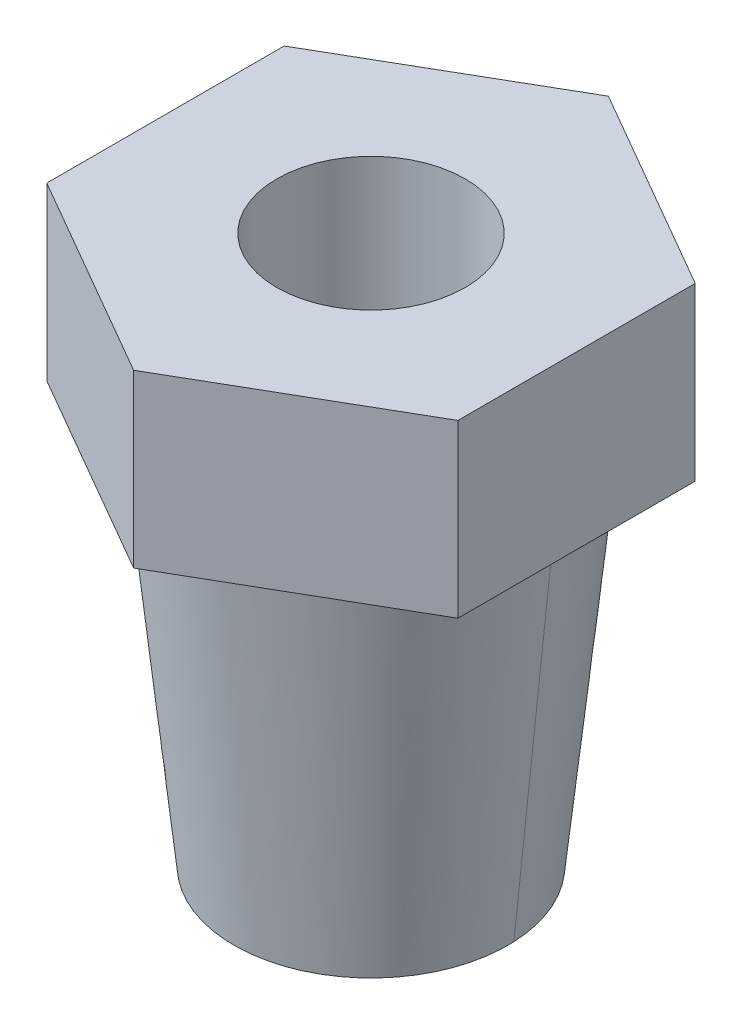
ISO-10303-21;
HEADER;
FILE_DESCRIPTION(('STEP AP214'),'2;1');
FILE_NAME('part.step','',(''),(''),'','','');
FILE_SCHEMA(('AUTOMOTIVE_DESIGN { 1 0 10303 214 1 1 1 1 }'));
ENDSEC;
DATA;
#1=APPLICATION_CONTEXT('core data for automotive mechanical design processes');
#2=APPLICATION_PROTOCOL_DEFINITION('international standard','automotive_design',2000,#1);
#3=PRODUCT_CONTEXT('',#1,'mechanical');
#4=PRODUCT('Part','Part','',(#3));
#5=PRODUCT_RELATED_PRODUCT_CATEGORY('part','',(#4));
#6=PRODUCT_DEFINITION_FORMATION('','',#4);
#7=PRODUCT_DEFINITION_CONTEXT('part definition',#1,'design');
#8=PRODUCT_DEFINITION('design','',#6,#7);
#9=PRODUCT_DEFINITION_SHAPE('','',#8);
#10=(LENGTH_UNIT() NAMED_UNIT(*) SI_UNIT(.MILLI.,.METRE.));
#11=(NAMED_UNIT(*) PLANE_ANGLE_UNIT() SI_UNIT($,.RADIAN.));
#12=(NAMED_UNIT(*) SI_UNIT($,.STERADIAN.) SOLID_ANGLE_UNIT());
#13=UNCERTAINTY_MEASURE_WITH_UNIT(LENGTH_MEASURE(1.E-05),#10,'distance_accuracy_value','');
#14=(GEOMETRIC_REPRESENTATION_CONTEXT(3) GLOBAL_UNCERTAINTY_ASSIGNED_CONTEXT((#13)) GLOBAL_UNIT_ASSIGNED_CONTEXT((#10,
#11,#12)) REPRESENTATION_CONTEXT('',''));
#15=CARTESIAN_POINT('',(0.,0.,0.));
#16=DIRECTION('',(0.,0.,1.));
#17=DIRECTION('',(1.,0.,0.));
#18=AXIS2_PLACEMENT_3D('',#15,#16,#17);
#19=CARTESIAN_POINT('',(0.,-5.,0.));
#20=DIRECTION('',(0.,1.,0.));
#21=DIRECTION('',(0.,0.,1.));
#22=AXIS2_PLACEMENT_3D('',#19,#20,#21);
#23=PLANE('',#22);
#24=DIRECTION('',(0.866025403784442,0.,0.499999999999995));
#25=VECTOR('',#24,1.);
#26=CARTESIAN_POINT('',(-5.99999999999996,-5.,3.46410161513783));
#27=LINE('',#26,#25);
#28=CARTESIAN_POINT('',(-5.99999999999996,-5.,3.46410161513783));
#29=VERTEX_POINT('',#28);
#30=CARTESIAN_POINT('',(0.,-5.,6.92820323027551));
#31=VERTEX_POINT('',#30);
#32=EDGE_CURVE('E147',#29,#31,#27,.T.);
#33=ORIENTED_EDGE('',*,*,#32,.F.);
#34=DIRECTION('',(0.,0.,1.));
#35=VECTOR('',#34,1.);
#36=CARTESIAN_POINT('',(-6.00000000000004,-5.,-3.4641016151377));
#37=LINE('',#36,#35);
#38=CARTESIAN_POINT('',(-6.00000000000004,-5.,-3.4641016151377));
#39=VERTEX_POINT('',#38);
#40=EDGE_CURVE('E123',#39,#29,#37,.T.);
#41=ORIENTED_EDGE('',*,*,#40,.F.);
#42=DIRECTION('',(-0.866025403784435,0.,0.500000000000007));
#43=VECTOR('',#42,1.);
#44=CARTESIAN_POINT('',(0.,-5.,-6.92820323027551));
#45=LINE('',#44,#43);
#46=CARTESIAN_POINT('',(0.,-5.,-6.92820323027551));
#47=VERTEX_POINT('',#46);
#48=EDGE_CURVE('E107',#47,#39,#45,.T.);
#49=ORIENTED_EDGE('',*,*,#48,.F.);
#50=DIRECTION('',(-0.866025403784442,0.,-0.499999999999995));
#51=VECTOR('',#50,1.);
#52=CARTESIAN_POINT('',(5.99999999999999,-5.,-3.46410161513778));
#53=LINE('',#52,#51);
#54=CARTESIAN_POINT('',(5.99999999999999,-5.,-3.46410161513778));
#55=VERTEX_POINT('',#54);
#56=EDGE_CURVE('E121',#55,#47,#53,.T.);
#57=ORIENTED_EDGE('',*,*,#56,.F.);
#58=DIRECTION('',(0.,0.,-1.));
#59=VECTOR('',#58,1.);
#60=CARTESIAN_POINT('',(6.00000000000001,-5.,3.46410161513774));
#61=LINE('',#60,#59);
#62=CARTESIAN_POINT('',(6.00000000000001,-5.,3.46410161513774));
#63=VERTEX_POINT('',#62);
#64=EDGE_CURVE('E126',#63,#55,#61,.T.);
#65=ORIENTED_EDGE('',*,*,#64,.F.);
#66=DIRECTION('',(0.866025403784438,0.,-0.500000000000001));
#67=VECTOR('',#66,1.);
#68=CARTESIAN_POINT('',(0.,-5.,6.92820323027551));
#69=LINE('',#68,#67);
#70=EDGE_CURVE('E128',#31,#63,#69,.T.);
#71=ORIENTED_EDGE('',*,*,#70,.F.);
#72=EDGE_LOOP('',(#33,#41,#49,#57,#65,#71));
#73=FACE_BOUND('',#72,.T.);
#74=CARTESIAN_POINT('',(0.,-5.,0.));
#75=DIRECTION('',(0.,1.,0.));
#76=DIRECTION('',(0.999204613771125,0.,-0.0398765572548238));
#77=AXIS2_PLACEMENT_3D('',#74,#75,#76);
#78=CIRCLE('',#77,5.1423305605899);
#79=CARTESIAN_POINT('',(5.13824042167769,-5.,-0.205058439022594));
#80=VERTEX_POINT('',#79);
#81=CARTESIAN_POINT('',(0.019253151585716,-5.,-5.14229451806593));
#82=VERTEX_POINT('',#81);
#83=EDGE_CURVE('E192',#80,#82,#78,.T.);
#84=ORIENTED_EDGE('',*,*,#83,.T.);
#85=CARTESIAN_POINT('',(0.,-5.,0.));
#86=DIRECTION('',(0.,1.,0.));
#87=DIRECTION('',(0.00374405172107575,0.,-0.999992991013792));
#88=AXIS2_PLACEMENT_3D('',#85,#86,#87);
#89=CIRCLE('',#88,5.1423305605899);
#90=EDGE_CURVE('E183',#82,#80,#89,.T.);
#91=ORIENTED_EDGE('',*,*,#90,.T.);
#92=EDGE_LOOP('',(#84,#91));
#93=FACE_BOUND('',#92,.T.);
#94=ADVANCED_FACE('F34',(#73,#93),#23,.F.);
#95=CARTESIAN_POINT('',(-5.99999999999996,-5.,3.46410161513783));
#96=DIRECTION('',(-0.499999999999995,0.,0.866025403784442));
#97=DIRECTION('',(0.866025403784442,0.,0.499999999999995));
#98=AXIS2_PLACEMENT_3D('',#95,#96,#97);
#99=PLANE('',#98);
#100=DIRECTION('',(0.866025403784442,0.,0.499999999999995));
#101=VECTOR('',#100,1.);
#102=CARTESIAN_POINT('',(-5.99999999999996,0.,3.46410161513783));
#103=LINE('',#102,#101);
#104=CARTESIAN_POINT('',(-5.99999999999996,0.,3.46410161513783));
#105=VERTEX_POINT('',#104);
#106=CARTESIAN_POINT('',(0.,0.,6.92820323027551));
#107=VERTEX_POINT('',#106);
#108=EDGE_CURVE('E133',#105,#107,#103,.T.);
#109=ORIENTED_EDGE('',*,*,#108,.F.);
#110=DIRECTION('',(0.,1.,0.));
#111=VECTOR('',#110,1.);
#112=CARTESIAN_POINT('',(-5.99999999999996,-5.,3.46410161513783));
#113=LINE('',#112,#111);
#114=EDGE_CURVE('E11',#29,#105,#113,.T.);
#115=ORIENTED_EDGE('',*,*,#114,.F.);
#116=ORIENTED_EDGE('',*,*,#32,.T.);
#117=DIRECTION('',(0.,1.,0.));
#118=VECTOR('',#117,1.);
#119=CARTESIAN_POINT('',(0.,-5.,6.92820323027551));
#120=LINE('',#119,#118);
#121=EDGE_CURVE('E91',#31,#107,#120,.T.);
#122=ORIENTED_EDGE('',*,*,#121,.T.);
#123=EDGE_LOOP('',(#109,#115,#116,#122));
#124=FACE_BOUND('',#123,.T.);
#125=ADVANCED_FACE('F36',(#124),#99,.T.);
#126=CARTESIAN_POINT('',(-6.00000000000004,-5.,-3.4641016151377));
#127=DIRECTION('',(-1.,0.,0.));
#128=DIRECTION('',(0.,0.,1.));
#129=AXIS2_PLACEMENT_3D('',#126,#127,#128);
#130=PLANE('',#129);
#131=DIRECTION('',(0.,0.,1.));
#132=VECTOR('',#131,1.);
#133=CARTESIAN_POINT('',(-6.00000000000004,0.,-3.4641016151377));
#134=LINE('',#133,#132);
#135=CARTESIAN_POINT('',(-6.00000000000004,0.,-3.4641016151377));
#136=VERTEX_POINT('',#135);
#137=EDGE_CURVE('E145',#136,#105,#134,.T.);
#138=ORIENTED_EDGE('',*,*,#137,.F.);
#139=DIRECTION('',(0.,1.,0.));
#140=VECTOR('',#139,1.);
#141=CARTESIAN_POINT('',(-6.00000000000004,-5.,-3.4641016151377));
#142=LINE('',#141,#140);
#143=EDGE_CURVE('E43',#39,#136,#142,.T.);
#144=ORIENTED_EDGE('',*,*,#143,.F.);
#145=ORIENTED_EDGE('',*,*,#40,.T.);
#146=ORIENTED_EDGE('',*,*,#114,.T.);
#147=EDGE_LOOP('',(#138,#144,#145,#146));
#148=FACE_BOUND('',#147,.T.);
#149=ADVANCED_FACE('F156',(#148),#130,.T.);
#150=CARTESIAN_POINT('',(0.,-5.,-6.92820323027551));
#151=DIRECTION('',(-0.500000000000007,0.,-0.866025403784435));
#152=DIRECTION('',(-0.866025403784435,0.,0.500000000000007));
#153=AXIS2_PLACEMENT_3D('',#150,#151,#152);
#154=PLANE('',#153);
#155=DIRECTION('',(-0.866025403784435,0.,0.500000000000007));
#156=VECTOR('',#155,1.);
#157=CARTESIAN_POINT('',(0.,0.,-6.92820323027551));
#158=LINE('',#157,#156);
#159=CARTESIAN_POINT('',(0.,0.,-6.92820323027551));
#160=VERTEX_POINT('',#159);
#161=EDGE_CURVE('E110',#160,#136,#158,.T.);
#162=ORIENTED_EDGE('',*,*,#161,.F.);
#163=DIRECTION('',(0.,1.,0.));
#164=VECTOR('',#163,1.);
#165=CARTESIAN_POINT('',(0.,-5.,-6.92820323027551));
#166=LINE('',#165,#164);
#167=EDGE_CURVE('E104',#47,#160,#166,.T.);
#168=ORIENTED_EDGE('',*,*,#167,.F.);
#169=ORIENTED_EDGE('',*,*,#48,.T.);
#170=ORIENTED_EDGE('',*,*,#143,.T.);
#171=EDGE_LOOP('',(#162,#168,#169,#170));
#172=FACE_BOUND('',#171,.T.);
#173=ADVANCED_FACE('F106',(#172),#154,.T.);
#174=CARTESIAN_POINT('',(5.99999999999999,-5.,-3.46410161513778));
#175=DIRECTION('',(0.499999999999995,0.,-0.866025403784442));
#176=DIRECTION('',(-0.866025403784442,0.,-0.499999999999995));
#177=AXIS2_PLACEMENT_3D('',#174,#175,#176);
#178=PLANE('',#177);
#179=DIRECTION('',(-0.866025403784442,0.,-0.499999999999995));
#180=VECTOR('',#179,1.);
#181=CARTESIAN_POINT('',(5.99999999999999,0.,-3.46410161513778));
#182=LINE('',#181,#180);
#183=CARTESIAN_POINT('',(5.99999999999999,0.,-3.46410161513778));
#184=VERTEX_POINT('',#183);
#185=EDGE_CURVE('E142',#184,#160,#182,.T.);
#186=ORIENTED_EDGE('',*,*,#185,.F.);
#187=DIRECTION('',(0.,1.,0.));
#188=VECTOR('',#187,1.);
#189=CARTESIAN_POINT('',(5.99999999999999,-5.,-3.46410161513778));
#190=LINE('',#189,#188);
#191=EDGE_CURVE('E115',#55,#184,#190,.T.);
#192=ORIENTED_EDGE('',*,*,#191,.F.);
#193=ORIENTED_EDGE('',*,*,#56,.T.);
#194=ORIENTED_EDGE('',*,*,#167,.T.);
#195=EDGE_LOOP('',(#186,#192,#193,#194));
#196=FACE_BOUND('',#195,.T.);
#197=ADVANCED_FACE('F125',(#196),#178,.T.);
#198=CARTESIAN_POINT('',(6.00000000000001,-5.,3.46410161513774));
#199=DIRECTION('',(1.,0.,0.));
#200=DIRECTION('',(0.,0.,-1.));
#201=AXIS2_PLACEMENT_3D('',#198,#199,#200);
#202=PLANE('',#201);
#203=DIRECTION('',(0.,0.,-1.));
#204=VECTOR('',#203,1.);
#205=CARTESIAN_POINT('',(6.00000000000001,0.,3.46410161513774));
#206=LINE('',#205,#204);
#207=CARTESIAN_POINT('',(6.00000000000001,0.,3.46410161513774));
#208=VERTEX_POINT('',#207);
#209=EDGE_CURVE('E139',#208,#184,#206,.T.);
#210=ORIENTED_EDGE('',*,*,#209,.F.);
#211=DIRECTION('',(0.,1.,0.));
#212=VECTOR('',#211,1.);
#213=CARTESIAN_POINT('',(6.00000000000001,-5.,3.46410161513774));
#214=LINE('',#213,#212);
#215=EDGE_CURVE('E151',#63,#208,#214,.T.);
#216=ORIENTED_EDGE('',*,*,#215,.F.);
#217=ORIENTED_EDGE('',*,*,#64,.T.);
#218=ORIENTED_EDGE('',*,*,#191,.T.);
#219=EDGE_LOOP('',(#210,#216,#217,#218));
#220=FACE_BOUND('',#219,.T.);
#221=ADVANCED_FACE('F180',(#220),#202,.T.);
#222=CARTESIAN_POINT('',(0.,-5.,6.92820323027551));
#223=DIRECTION('',(0.500000000000001,0.,0.866025403784438));
#224=DIRECTION('',(0.866025403784438,0.,-0.500000000000001));
#225=AXIS2_PLACEMENT_3D('',#222,#223,#224);
#226=PLANE('',#225);
#227=DIRECTION('',(0.866025403784438,0.,-0.500000000000001));
#228=VECTOR('',#227,1.);
#229=CARTESIAN_POINT('',(0.,0.,6.92820323027551));
#230=LINE('',#229,#228);
#231=EDGE_CURVE('E136',#107,#208,#230,.T.);
#232=ORIENTED_EDGE('',*,*,#231,.F.);
#233=ORIENTED_EDGE('',*,*,#121,.F.);
#234=ORIENTED_EDGE('',*,*,#70,.T.);
#235=ORIENTED_EDGE('',*,*,#215,.T.);
#236=EDGE_LOOP('',(#232,#233,#234,#235));
#237=FACE_BOUND('',#236,.T.);
#238=ADVANCED_FACE('F152',(#237),#226,.T.);
#239=CARTESIAN_POINT('',(0.,0.,0.));
#240=DIRECTION('',(0.,1.,0.));
#241=DIRECTION('',(0.,0.,1.));
#242=AXIS2_PLACEMENT_3D('',#239,#240,#241);
#243=PLANE('',#242);
#244=CARTESIAN_POINT('',(0.,0.,0.));
#245=DIRECTION('',(0.,1.,0.));
#246=DIRECTION('',(0.,0.,1.));
#247=AXIS2_PLACEMENT_3D('',#244,#245,#246);
#248=CIRCLE('',#247,2.75);
#249=CARTESIAN_POINT('',(0.,0.,2.75));
#250=VERTEX_POINT('',#249);
#251=EDGE_CURVE('E38',#250,#250,#248,.T.);
#252=ORIENTED_EDGE('',*,*,#251,.F.);
#253=EDGE_LOOP('',(#252));
#254=FACE_BOUND('',#253,.T.);
#255=ORIENTED_EDGE('',*,*,#108,.T.);
#256=ORIENTED_EDGE('',*,*,#231,.T.);
#257=ORIENTED_EDGE('',*,*,#209,.T.);
#258=ORIENTED_EDGE('',*,*,#185,.T.);
#259=ORIENTED_EDGE('',*,*,#161,.T.);
#260=ORIENTED_EDGE('',*,*,#137,.T.);
#261=EDGE_LOOP('',(#255,#256,#257,#258,#259,#260));
#262=FACE_BOUND('',#261,.T.);
#263=ADVANCED_FACE('F155',(#254,#262),#243,.T.);
#264=CARTESIAN_POINT('',(0.,6.00000000000001,0.));
#265=DIRECTION('',(0.,-1.,0.));
#266=DIRECTION('',(0.,0.,-1.));
#267=AXIS2_PLACEMENT_3D('',#264,#265,#266);
#268=CYLINDRICAL_SURFACE('',#267,2.75);
#269=ORIENTED_EDGE('',*,*,#251,.T.);
#270=EDGE_LOOP('',(#269));
#271=FACE_BOUND('',#270,.T.);
#272=CARTESIAN_POINT('',(0.,-16.,0.));
#273=DIRECTION('',(0.,-1.,0.));
#274=DIRECTION('',(0.,0.,-1.));
#275=AXIS2_PLACEMENT_3D('',#272,#273,#274);
#276=CIRCLE('',#275,2.75);
#277=CARTESIAN_POINT('',(0.,-16.,-2.75));
#278=VERTEX_POINT('',#277);
#279=EDGE_CURVE('E197',#278,#278,#276,.T.);
#280=ORIENTED_EDGE('',*,*,#279,.T.);
#281=EDGE_LOOP('',(#280));
#282=FACE_BOUND('',#281,.T.);
#283=ADVANCED_FACE('F170',(#271,#282),#268,.F.);
#284=CARTESIAN_POINT('',(0.0192531515857171,-5.,-5.14229451806593));
#285=CARTESIAN_POINT('',(-5.44961421407725,-5.,-5.16277038385373));
#286=CARTESIAN_POINT('',(-7.50622485140648,-5.,-0.0952974228289336));
#287=CARTESIAN_POINT('',(-3.56987535001086,-5.,3.70129079913505));
#288=CARTESIAN_POINT('',(0.366474151384768,-5.,7.49787902109902));
#289=CARTESIAN_POINT('',(5.35632155283122,-5.,5.25949736584645));
#290=CARTESIAN_POINT('',(5.13824042167769,-5.,-0.205058439022592));
#291=CARTESIAN_POINT('',(0.,-16.,-4.));
#292=CARTESIAN_POINT('',(-4.2540288942609,-16.,-4.));
#293=CARTESIAN_POINT('',(-5.83900933665289,-16.,-0.052266621155692));
#294=CARTESIAN_POINT('',(-2.76605516718018,-16.,2.88945302992034));
#295=CARTESIAN_POINT('',(0.306899002292531,-16.,5.83117268099638));
#296=CARTESIAN_POINT('',(4.18174271550152,-16.,4.07551097343101));
#297=CARTESIAN_POINT('',(3.99619324186779,-16.,-0.174469406057921));
#298=(BOUNDED_SURFACE() B_SPLINE_SURFACE(1,3,((#284,#285,#286,#287,#288,#289,#290),(#291,#292,
#293,#294,#295,#296,#297)),.UNSPECIFIED.,.F.,.F.,.F.) B_SPLINE_SURFACE_WITH_KNOTS((2,2),(4,3,4),
(0.,1.),(0.,0.5,1.),
.UNSPECIFIED.) GEOMETRIC_REPRESENTATION_ITEM() RATIONAL_B_SPLINE_SURFACE(((1.,0.581722249940565,
0.581722249940565,1.,0.581722249940565,0.581722249940565,1.),(1.,0.581722249940565,
0.581722249940565,1.,0.581722249940565,0.581722249940565,1.))) REPRESENTATION_ITEM('') SURFACE());
#299=DIRECTION('',(-0.103267002574811,-0.99464982568584,0.00276594330056448));
#300=VECTOR('',#299,1.);
#301=CARTESIAN_POINT('',(5.13824042167769,-5.,-0.205058439022594));
#302=LINE('',#301,#300);
#303=CARTESIAN_POINT('',(3.99619324186779,-16.,-0.174469406057922));
#304=VERTEX_POINT('',#303);
#305=EDGE_CURVE('E193',#80,#304,#302,.T.);
#306=DIRECTION('',(-0.00174092216987598,-0.99464982568584,0.10328936757056));
#307=VECTOR('',#306,1.);
#308=CARTESIAN_POINT('',(0.0192531515857171,-5.,-5.14229451806593));
#309=LINE('',#308,#307);
#310=CARTESIAN_POINT('',(0.,-16.,-4.));
#311=VERTEX_POINT('',#310);
#312=EDGE_CURVE('E51',#82,#311,#309,.T.);
#313=CARTESIAN_POINT('',(0.,-16.,0.));
#314=DIRECTION('',(0.,1.,0.));
#315=DIRECTION('',(0.,0.,-1.));
#316=AXIS2_PLACEMENT_3D('',#313,#314,#315);
#317=CIRCLE('',#316,4.);
#318=EDGE_CURVE('E185',#311,#304,#317,.T.);
#319=ORIENTED_EDGE('',*,*,#305,.F.);
#320=ORIENTED_EDGE('',*,*,#90,.F.);
#321=ORIENTED_EDGE('',*,*,#312,.T.);
#322=ORIENTED_EDGE('',*,*,#318,.T.);
#323=EDGE_LOOP('',(#319,#320,#321,#322));
#324=FACE_BOUND('',#323,.T.);
#325=ADVANCED_FACE('F178',(#324),#298,.T.);
#326=CARTESIAN_POINT('',(5.13824042167769,-5.,-0.205058439022594));
#327=CARTESIAN_POINT('',(5.02223502161322,-5.,-3.11185729395037));
#328=CARTESIAN_POINT('',(2.92834548478076,-5.,-5.1314026495681));
#329=CARTESIAN_POINT('',(0.019253151585716,-5.,-5.14229451806593));
#330=CARTESIAN_POINT('',(3.99619324186779,-16.,-0.174469406057922));
#331=CARTESIAN_POINT('',(3.89749263073844,-16.,-2.43519077879171));
#332=CARTESIAN_POINT('',(2.26287492711653,-16.,-4.));
#333=CARTESIAN_POINT('',(0.,-16.,-4.));
#334=(BOUNDED_SURFACE() B_SPLINE_SURFACE(1,3,((#326,#327,#328,#329),(#330,#331,#332,#333)),
.UNSPECIFIED.,.F.,.F.,.F.) B_SPLINE_SURFACE_WITH_KNOTS((2,2),(4,4),(0.,1.),(0.,1.),
.UNSPECIFIED.) GEOMETRIC_REPRESENTATION_ITEM() RATIONAL_B_SPLINE_SURFACE(((1.,0.814908838320057,
0.814908838320057,1.),(1.,0.814908838320057,0.814908838320057,1.))) REPRESENTATION_ITEM('') SURFACE());
#335=CARTESIAN_POINT('',(0.,-16.,0.));
#336=DIRECTION('',(0.,1.,0.));
#337=DIRECTION('',(0.999048310466947,0.,-0.0436173515144804));
#338=AXIS2_PLACEMENT_3D('',#335,#336,#337);
#339=CIRCLE('',#338,4.);
#340=EDGE_CURVE('E196',#304,#311,#339,.T.);
#341=ORIENTED_EDGE('',*,*,#312,.F.);
#342=ORIENTED_EDGE('',*,*,#83,.F.);
#343=ORIENTED_EDGE('',*,*,#305,.T.);
#344=ORIENTED_EDGE('',*,*,#340,.T.);
#345=EDGE_LOOP('',(#341,#342,#343,#344));
#346=FACE_BOUND('',#345,.T.);
#347=ADVANCED_FACE('F259',(#346),#334,.T.);
#348=CARTESIAN_POINT('',(0.,-16.,0.));
#349=DIRECTION('',(0.,-1.,0.));
#350=DIRECTION('',(0.,0.,-1.));
#351=AXIS2_PLACEMENT_3D('',#348,#349,#350);
#352=PLANE('',#351);
#353=ORIENTED_EDGE('',*,*,#279,.F.);
#354=EDGE_LOOP('',(#353));
#355=FACE_BOUND('',#354,.T.);
#356=ORIENTED_EDGE('',*,*,#340,.F.);
#357=ORIENTED_EDGE('',*,*,#318,.F.);
#358=EDGE_LOOP('',(#356,#357));
#359=FACE_BOUND('',#358,.T.);
#360=ADVANCED_FACE('F254',(#355,#359),#352,.T.);
#361=CLOSED_SHELL('',(#94,#125,#149,#173,#197,#221,#238,#263,#283,#325,#347,#360));
#362=MANIFOLD_SOLID_BREP('B2',#361);
#363=ADVANCED_BREP_SHAPE_REPRESENTATION('',(#18,#362),#14);
#364=SHAPE_DEFINITION_REPRESENTATION(#9,#363);
ENDSEC;
END-ISO-10303-21;
